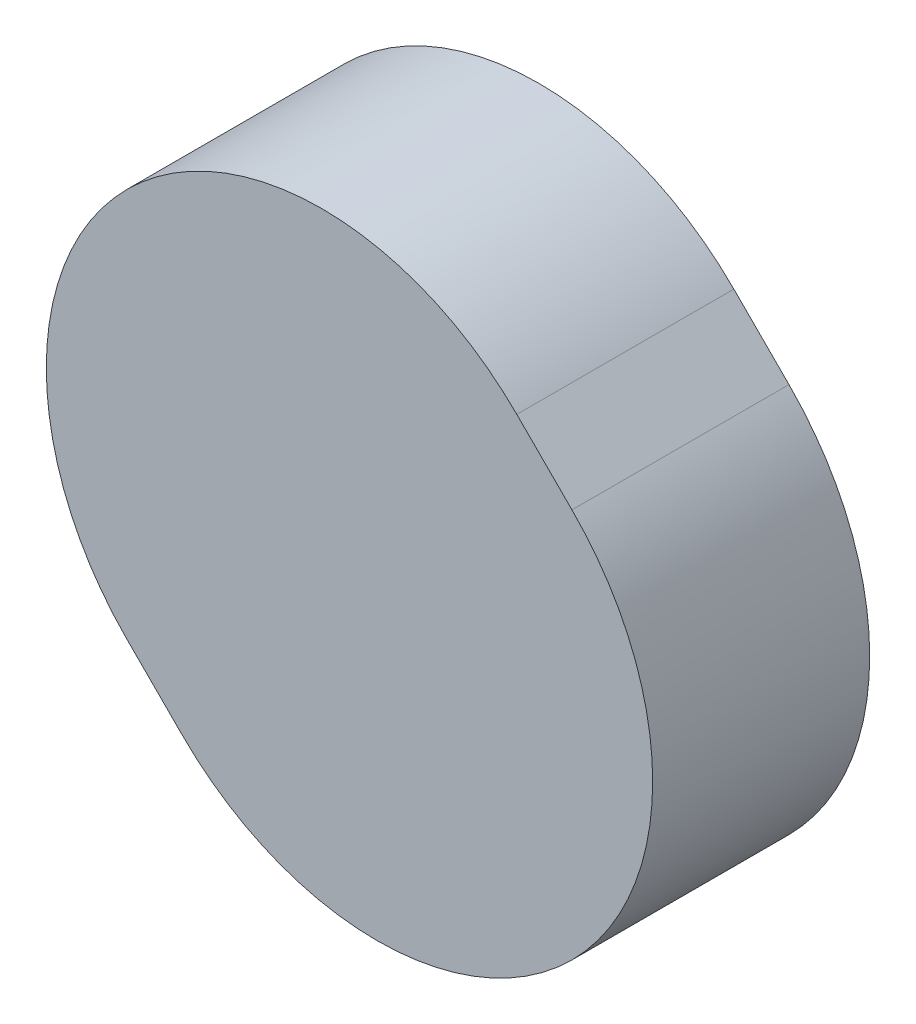
ISO-10303-21;
HEADER;
FILE_DESCRIPTION(('STEP AP214'),'2;1');
FILE_NAME('part.step','',(''),(''),'','','');
FILE_SCHEMA(('AUTOMOTIVE_DESIGN { 1 0 10303 214 1 1 1 1 }'));
ENDSEC;
DATA;
#1=APPLICATION_CONTEXT('core data for automotive mechanical design processes');
#2=APPLICATION_PROTOCOL_DEFINITION('international standard','automotive_design',2000,#1);
#3=PRODUCT_CONTEXT('',#1,'mechanical');
#4=PRODUCT('Part','Part','',(#3));
#5=PRODUCT_RELATED_PRODUCT_CATEGORY('part','',(#4));
#6=PRODUCT_DEFINITION_FORMATION('','',#4);
#7=PRODUCT_DEFINITION_CONTEXT('part definition',#1,'design');
#8=PRODUCT_DEFINITION('design','',#6,#7);
#9=PRODUCT_DEFINITION_SHAPE('','',#8);
#10=(LENGTH_UNIT() NAMED_UNIT(*) SI_UNIT(.MILLI.,.METRE.));
#11=(NAMED_UNIT(*) PLANE_ANGLE_UNIT() SI_UNIT($,.RADIAN.));
#12=(NAMED_UNIT(*) SI_UNIT($,.STERADIAN.) SOLID_ANGLE_UNIT());
#13=UNCERTAINTY_MEASURE_WITH_UNIT(LENGTH_MEASURE(1.E-05),#10,'distance_accuracy_value','');
#14=(GEOMETRIC_REPRESENTATION_CONTEXT(3) GLOBAL_UNCERTAINTY_ASSIGNED_CONTEXT((#13)) GLOBAL_UNIT_ASSIGNED_CONTEXT((#10,
#11,#12)) REPRESENTATION_CONTEXT('',''));
#15=CARTESIAN_POINT('',(0.,0.,0.));
#16=DIRECTION('',(0.,0.,1.));
#17=DIRECTION('',(1.,0.,0.));
#18=AXIS2_PLACEMENT_3D('',#15,#16,#17);
#19=CARTESIAN_POINT('',(91.41279406,75.51239406,0.));
#20=DIRECTION('',(0.707106781186548,0.707106781186548,0.));
#21=DIRECTION('',(0.707106781186548,-0.707106781186548,0.));
#22=AXIS2_PLACEMENT_3D('',#19,#20,#21);
#23=PLANE('',#22);
#24=DIRECTION('',(0.707106781186548,-0.707106781186548,0.));
#25=VECTOR('',#24,1.);
#26=CARTESIAN_POINT('',(91.41279406,75.51239406,0.1999996));
#27=LINE('',#26,#25);
#28=CARTESIAN_POINT('',(91.41279406,75.51239406,0.1999996));
#29=VERTEX_POINT('',#28);
#30=CARTESIAN_POINT('',(91.46359406,75.46159406,0.1999996));
#31=VERTEX_POINT('',#30);
#32=EDGE_CURVE('E11',#29,#31,#27,.T.);
#33=ORIENTED_EDGE('',*,*,#32,.F.);
#34=DIRECTION('',(0.,0.,1.));
#35=VECTOR('',#34,1.);
#36=CARTESIAN_POINT('',(91.41279406,75.51239406,0.));
#37=LINE('',#36,#35);
#38=CARTESIAN_POINT('',(91.41279406,75.51239406,0.));
#39=VERTEX_POINT('',#38);
#40=EDGE_CURVE('E24',#39,#29,#37,.T.);
#41=ORIENTED_EDGE('',*,*,#40,.F.);
#42=DIRECTION('',(0.707106781186548,-0.707106781186548,0.));
#43=VECTOR('',#42,1.);
#44=CARTESIAN_POINT('',(91.41279406,75.51239406,0.));
#45=LINE('',#44,#43);
#46=CARTESIAN_POINT('',(91.46359406,75.46159406,0.));
#47=VERTEX_POINT('',#46);
#48=EDGE_CURVE('E75',#39,#47,#45,.T.);
#49=ORIENTED_EDGE('',*,*,#48,.T.);
#50=DIRECTION('',(0.,0.,1.));
#51=VECTOR('',#50,1.);
#52=CARTESIAN_POINT('',(91.46359406,75.46159406,0.));
#53=LINE('',#52,#51);
#54=EDGE_CURVE('E37',#47,#31,#53,.T.);
#55=ORIENTED_EDGE('',*,*,#54,.T.);
#56=EDGE_LOOP('',(#33,#41,#49,#55));
#57=FACE_BOUND('',#56,.T.);
#58=ADVANCED_FACE('F17',(#57),#23,.F.);
#59=CARTESIAN_POINT('',(91.6432,75.6412,0.));
#60=DIRECTION('',(0.,0.,-1.));
#61=DIRECTION('',(-0.707106781186548,-0.707106781186548,0.));
#62=AXIS2_PLACEMENT_3D('',#59,#60,#61);
#63=CYLINDRICAL_SURFACE('',#62,0.254001156230771);
#64=CARTESIAN_POINT('',(91.6432,75.6412,0.1999996));
#65=DIRECTION('',(0.,0.,1.));
#66=DIRECTION('',(-0.707106781186548,-0.707106781186548,0.));
#67=AXIS2_PLACEMENT_3D('',#64,#65,#66);
#68=CIRCLE('',#67,0.254001156230771);
#69=CARTESIAN_POINT('',(91.82280594,75.82080594,0.1999996));
#70=VERTEX_POINT('',#69);
#71=EDGE_CURVE('E83',#31,#70,#68,.T.);
#72=ORIENTED_EDGE('',*,*,#71,.F.);
#73=ORIENTED_EDGE('',*,*,#54,.F.);
#74=CARTESIAN_POINT('',(91.6432,75.6412,0.));
#75=DIRECTION('',(0.,0.,1.));
#76=DIRECTION('',(-0.707106781186548,-0.707106781186548,0.));
#77=AXIS2_PLACEMENT_3D('',#74,#75,#76);
#78=CIRCLE('',#77,0.254001156230771);
#79=CARTESIAN_POINT('',(91.82280594,75.82080594,0.));
#80=VERTEX_POINT('',#79);
#81=EDGE_CURVE('E81',#47,#80,#78,.T.);
#82=ORIENTED_EDGE('',*,*,#81,.T.);
#83=DIRECTION('',(0.,0.,1.));
#84=VECTOR('',#83,1.);
#85=CARTESIAN_POINT('',(91.82280594,75.82080594,0.));
#86=LINE('',#85,#84);
#87=EDGE_CURVE('E67',#80,#70,#86,.T.);
#88=ORIENTED_EDGE('',*,*,#87,.T.);
#89=EDGE_LOOP('',(#72,#73,#82,#88));
#90=FACE_BOUND('',#89,.T.);
#91=ADVANCED_FACE('F89',(#90),#63,.T.);
#92=CARTESIAN_POINT('',(91.82280594,75.82080594,0.));
#93=DIRECTION('',(-0.707106781186449,-0.707106781186646,0.));
#94=DIRECTION('',(-0.707106781186646,0.707106781186449,0.));
#95=AXIS2_PLACEMENT_3D('',#92,#93,#94);
#96=PLANE('',#95);
#97=DIRECTION('',(-0.707106781186646,0.707106781186449,0.));
#98=VECTOR('',#97,1.);
#99=CARTESIAN_POINT('',(91.82280594,75.82080594,0.1999996));
#100=LINE('',#99,#98);
#101=CARTESIAN_POINT('',(91.77200594,75.87160594,0.1999996));
#102=VERTEX_POINT('',#101);
#103=EDGE_CURVE('E71',#70,#102,#100,.T.);
#104=ORIENTED_EDGE('',*,*,#103,.F.);
#105=ORIENTED_EDGE('',*,*,#87,.F.);
#106=DIRECTION('',(-0.707106781186646,0.707106781186449,0.));
#107=VECTOR('',#106,1.);
#108=CARTESIAN_POINT('',(91.82280594,75.82080594,0.));
#109=LINE('',#108,#107);
#110=CARTESIAN_POINT('',(91.77200594,75.87160594,0.));
#111=VERTEX_POINT('',#110);
#112=EDGE_CURVE('E63',#80,#111,#109,.T.);
#113=ORIENTED_EDGE('',*,*,#112,.T.);
#114=DIRECTION('',(0.,0.,1.));
#115=VECTOR('',#114,1.);
#116=CARTESIAN_POINT('',(91.77200594,75.87160594,0.));
#117=LINE('',#116,#115);
#118=EDGE_CURVE('E53',#111,#102,#117,.T.);
#119=ORIENTED_EDGE('',*,*,#118,.T.);
#120=EDGE_LOOP('',(#104,#105,#113,#119));
#121=FACE_BOUND('',#120,.T.);
#122=ADVANCED_FACE('F66',(#121),#96,.F.);
#123=CARTESIAN_POINT('',(91.5924,75.692,0.));
#124=DIRECTION('',(0.,0.,-1.));
#125=DIRECTION('',(0.70710678118652,0.707106781186576,0.));
#126=AXIS2_PLACEMENT_3D('',#123,#124,#125);
#127=CYLINDRICAL_SURFACE('',#126,0.254001156230768);
#128=CARTESIAN_POINT('',(91.5924,75.692,0.1999996));
#129=DIRECTION('',(0.,0.,1.));
#130=DIRECTION('',(0.70710678118652,0.707106781186576,0.));
#131=AXIS2_PLACEMENT_3D('',#128,#129,#130);
#132=CIRCLE('',#131,0.254001156230768);
#133=EDGE_CURVE('E59',#102,#29,#132,.T.);
#134=ORIENTED_EDGE('',*,*,#133,.F.);
#135=ORIENTED_EDGE('',*,*,#118,.F.);
#136=CARTESIAN_POINT('',(91.5924,75.692,0.));
#137=DIRECTION('',(0.,0.,1.));
#138=DIRECTION('',(0.70710678118652,0.707106781186576,0.));
#139=AXIS2_PLACEMENT_3D('',#136,#137,#138);
#140=CIRCLE('',#139,0.254001156230768);
#141=EDGE_CURVE('E57',#111,#39,#140,.T.);
#142=ORIENTED_EDGE('',*,*,#141,.T.);
#143=ORIENTED_EDGE('',*,*,#40,.T.);
#144=EDGE_LOOP('',(#134,#135,#142,#143));
#145=FACE_BOUND('',#144,.T.);
#146=ADVANCED_FACE('F55',(#145),#127,.T.);
#147=CARTESIAN_POINT('',(91.41279406,75.51239406,0.));
#148=DIRECTION('',(0.,0.,-1.));
#149=DIRECTION('',(-1.,0.,0.));
#150=AXIS2_PLACEMENT_3D('',#147,#148,#149);
#151=PLANE('',#150);
#152=ORIENTED_EDGE('',*,*,#141,.F.);
#153=ORIENTED_EDGE('',*,*,#112,.F.);
#154=ORIENTED_EDGE('',*,*,#81,.F.);
#155=ORIENTED_EDGE('',*,*,#48,.F.);
#156=EDGE_LOOP('',(#152,#153,#154,#155));
#157=FACE_BOUND('',#156,.T.);
#158=ADVANCED_FACE('F74',(#157),#151,.T.);
#159=CARTESIAN_POINT('',(91.41279406,75.51239406,0.1999996));
#160=DIRECTION('',(0.,0.,-1.));
#161=DIRECTION('',(-1.,0.,0.));
#162=AXIS2_PLACEMENT_3D('',#159,#160,#161);
#163=PLANE('',#162);
#164=ORIENTED_EDGE('',*,*,#32,.T.);
#165=ORIENTED_EDGE('',*,*,#71,.T.);
#166=ORIENTED_EDGE('',*,*,#103,.T.);
#167=ORIENTED_EDGE('',*,*,#133,.T.);
#168=EDGE_LOOP('',(#164,#165,#166,#167));
#169=FACE_BOUND('',#168,.T.);
#170=ADVANCED_FACE('F91',(#169),#163,.F.);
#171=CLOSED_SHELL('',(#58,#91,#122,#146,#158,#170));
#172=MANIFOLD_SOLID_BREP('B1',#171);
#173=ADVANCED_BREP_SHAPE_REPRESENTATION('',(#18,#172),#14);
#174=SHAPE_DEFINITION_REPRESENTATION(#9,#173);
ENDSEC;
END-ISO-10303-21;
